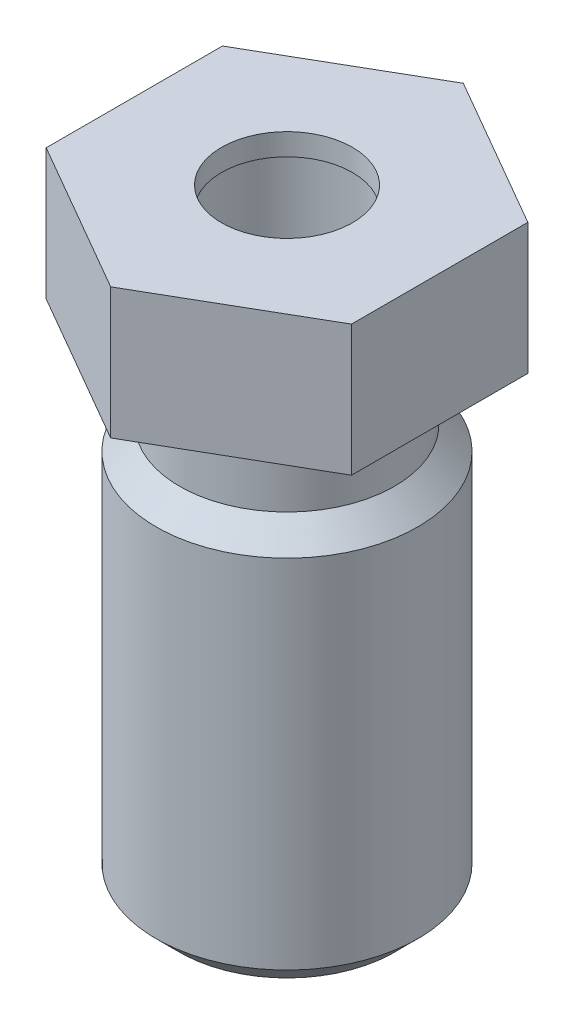
ISO-10303-21;
HEADER;
FILE_DESCRIPTION(('STEP AP214'),'2;1');
FILE_NAME('part.step','',(''),(''),'','','');
FILE_SCHEMA(('AUTOMOTIVE_DESIGN { 1 0 10303 214 1 1 1 1 }'));
ENDSEC;
DATA;
#1=APPLICATION_CONTEXT('core data for automotive mechanical design processes');
#2=APPLICATION_PROTOCOL_DEFINITION('international standard','automotive_design',2000,#1);
#3=PRODUCT_CONTEXT('',#1,'mechanical');
#4=PRODUCT('Part','Part','',(#3));
#5=PRODUCT_RELATED_PRODUCT_CATEGORY('part','',(#4));
#6=PRODUCT_DEFINITION_FORMATION('','',#4);
#7=PRODUCT_DEFINITION_CONTEXT('part definition',#1,'design');
#8=PRODUCT_DEFINITION('design','',#6,#7);
#9=PRODUCT_DEFINITION_SHAPE('','',#8);
#10=(LENGTH_UNIT() NAMED_UNIT(*) SI_UNIT(.MILLI.,.METRE.));
#11=(NAMED_UNIT(*) PLANE_ANGLE_UNIT() SI_UNIT($,.RADIAN.));
#12=(NAMED_UNIT(*) SI_UNIT($,.STERADIAN.) SOLID_ANGLE_UNIT());
#13=UNCERTAINTY_MEASURE_WITH_UNIT(LENGTH_MEASURE(1.E-05),#10,'distance_accuracy_value','');
#14=(GEOMETRIC_REPRESENTATION_CONTEXT(3) GLOBAL_UNCERTAINTY_ASSIGNED_CONTEXT((#13)) GLOBAL_UNIT_ASSIGNED_CONTEXT((#10,
#11,#12)) REPRESENTATION_CONTEXT('',''));
#15=CARTESIAN_POINT('',(0.,0.,0.));
#16=DIRECTION('',(0.,0.,1.));
#17=DIRECTION('',(1.,0.,0.));
#18=AXIS2_PLACEMENT_3D('',#15,#16,#17);
#19=CARTESIAN_POINT('',(4.9265,-6.,0.));
#20=DIRECTION('',(0.,-1.,0.));
#21=DIRECTION('',(0.,0.,-1.));
#22=AXIS2_PLACEMENT_3D('',#19,#20,#21);
#23=PLANE('',#22);
#24=CARTESIAN_POINT('',(0.,-6.,0.));
#25=DIRECTION('',(0.,-1.,0.));
#26=DIRECTION('',(0.,0.,-1.));
#27=AXIS2_PLACEMENT_3D('',#24,#25,#26);
#28=CIRCLE('',#27,4.9265);
#29=CARTESIAN_POINT('',(0.,-6.,-4.9265));
#30=VERTEX_POINT('',#29);
#31=EDGE_CURVE('E93',#30,#30,#28,.T.);
#32=ORIENTED_EDGE('',*,*,#31,.F.);
#33=EDGE_LOOP('',(#32));
#34=FACE_BOUND('',#33,.T.);
#35=DIRECTION('',(0.866025403784438,0.,0.5));
#36=VECTOR('',#35,1.);
#37=CARTESIAN_POINT('',(-7.,-6.,4.0414518843274));
#38=LINE('',#37,#36);
#39=CARTESIAN_POINT('',(-7.,-6.,4.0414518843274));
#40=VERTEX_POINT('',#39);
#41=CARTESIAN_POINT('',(0.,-6.,8.0829037686548));
#42=VERTEX_POINT('',#41);
#43=EDGE_CURVE('E80',#40,#42,#38,.T.);
#44=ORIENTED_EDGE('',*,*,#43,.F.);
#45=DIRECTION('',(0.,0.,1.));
#46=VECTOR('',#45,1.);
#47=CARTESIAN_POINT('',(-7.,-6.,-4.0414518843274));
#48=LINE('',#47,#46);
#49=CARTESIAN_POINT('',(-7.,-6.,-4.0414518843274));
#50=VERTEX_POINT('',#49);
#51=EDGE_CURVE('E69',#50,#40,#48,.T.);
#52=ORIENTED_EDGE('',*,*,#51,.F.);
#53=DIRECTION('',(-0.866025403784438,0.,0.5));
#54=VECTOR('',#53,1.);
#55=CARTESIAN_POINT('',(0.,-6.,-8.0829037686548));
#56=LINE('',#55,#54);
#57=CARTESIAN_POINT('',(0.,-6.,-8.0829037686548));
#58=VERTEX_POINT('',#57);
#59=EDGE_CURVE('E79',#58,#50,#56,.T.);
#60=ORIENTED_EDGE('',*,*,#59,.F.);
#61=DIRECTION('',(-0.866025403784438,0.,-0.5));
#62=VECTOR('',#61,1.);
#63=CARTESIAN_POINT('',(7.,-6.,-4.0414518843274));
#64=LINE('',#63,#62);
#65=CARTESIAN_POINT('',(7.,-6.,-4.0414518843274));
#66=VERTEX_POINT('',#65);
#67=EDGE_CURVE('E103',#66,#58,#64,.T.);
#68=ORIENTED_EDGE('',*,*,#67,.F.);
#69=DIRECTION('',(0.,0.,-1.));
#70=VECTOR('',#69,1.);
#71=CARTESIAN_POINT('',(7.,-6.,4.0414518843274));
#72=LINE('',#71,#70);
#73=CARTESIAN_POINT('',(7.,-6.,4.0414518843274));
#74=VERTEX_POINT('',#73);
#75=EDGE_CURVE('E107',#74,#66,#72,.T.);
#76=ORIENTED_EDGE('',*,*,#75,.F.);
#77=DIRECTION('',(0.866025403784438,0.,-0.5));
#78=VECTOR('',#77,1.);
#79=CARTESIAN_POINT('',(0.,-6.,8.0829037686548));
#80=LINE('',#79,#78);
#81=EDGE_CURVE('E92',#42,#74,#80,.T.);
#82=ORIENTED_EDGE('',*,*,#81,.F.);
#83=EDGE_LOOP('',(#44,#52,#60,#68,#76,#82));
#84=FACE_BOUND('',#83,.T.);
#85=ADVANCED_FACE('F17',(#34,#84),#23,.T.);
#86=CARTESIAN_POINT('',(0.,-6.,0.));
#87=DIRECTION('',(0.,-1.,0.));
#88=DIRECTION('',(0.,0.,-1.));
#89=AXIS2_PLACEMENT_3D('',#86,#87,#88);
#90=CYLINDRICAL_SURFACE('',#89,4.9265);
#91=ORIENTED_EDGE('',*,*,#31,.T.);
#92=EDGE_LOOP('',(#91));
#93=FACE_BOUND('',#92,.T.);
#94=CARTESIAN_POINT('',(0.,-9.5,0.));
#95=DIRECTION('',(0.,-1.,0.));
#96=DIRECTION('',(0.,0.,-1.));
#97=AXIS2_PLACEMENT_3D('',#94,#95,#96);
#98=CIRCLE('',#97,4.9265);
#99=CARTESIAN_POINT('',(0.,-9.5,-4.9265));
#100=VERTEX_POINT('',#99);
#101=EDGE_CURVE('E114',#100,#100,#98,.T.);
#102=ORIENTED_EDGE('',*,*,#101,.F.);
#103=EDGE_LOOP('',(#102));
#104=FACE_BOUND('',#103,.T.);
#105=ADVANCED_FACE('F198',(#93,#104),#90,.T.);
#106=CARTESIAN_POINT('',(-7.,-6.,4.0414518843274));
#107=DIRECTION('',(-0.5,0.,0.866025403784438));
#108=DIRECTION('',(0.866025403784438,0.,0.5));
#109=AXIS2_PLACEMENT_3D('',#106,#107,#108);
#110=PLANE('',#109);
#111=DIRECTION('',(0.866025403784438,0.,0.5));
#112=VECTOR('',#111,1.);
#113=CARTESIAN_POINT('',(-7.,0.,4.0414518843274));
#114=LINE('',#113,#112);
#115=CARTESIAN_POINT('',(-7.,0.,4.0414518843274));
#116=VERTEX_POINT('',#115);
#117=CARTESIAN_POINT('',(0.,0.,8.0829037686548));
#118=VERTEX_POINT('',#117);
#119=EDGE_CURVE('E87',#116,#118,#114,.T.);
#120=ORIENTED_EDGE('',*,*,#119,.F.);
#121=DIRECTION('',(0.,1.,0.));
#122=VECTOR('',#121,1.);
#123=CARTESIAN_POINT('',(-7.,-6.,4.0414518843274));
#124=LINE('',#123,#122);
#125=EDGE_CURVE('E73',#40,#116,#124,.T.);
#126=ORIENTED_EDGE('',*,*,#125,.F.);
#127=ORIENTED_EDGE('',*,*,#43,.T.);
#128=DIRECTION('',(0.,1.,0.));
#129=VECTOR('',#128,1.);
#130=CARTESIAN_POINT('',(0.,-6.,8.0829037686548));
#131=LINE('',#130,#129);
#132=EDGE_CURVE('E88',#42,#118,#131,.T.);
#133=ORIENTED_EDGE('',*,*,#132,.T.);
#134=EDGE_LOOP('',(#120,#126,#127,#133));
#135=FACE_BOUND('',#134,.T.);
#136=ADVANCED_FACE('F85',(#135),#110,.T.);
#137=CARTESIAN_POINT('',(-7.,-6.,-4.0414518843274));
#138=DIRECTION('',(-1.,0.,0.));
#139=DIRECTION('',(0.,0.,1.));
#140=AXIS2_PLACEMENT_3D('',#137,#138,#139);
#141=PLANE('',#140);
#142=DIRECTION('',(0.,0.,1.));
#143=VECTOR('',#142,1.);
#144=CARTESIAN_POINT('',(-7.,0.,-4.0414518843274));
#145=LINE('',#144,#143);
#146=CARTESIAN_POINT('',(-7.,0.,-4.0414518843274));
#147=VERTEX_POINT('',#146);
#148=EDGE_CURVE('E125',#147,#116,#145,.T.);
#149=ORIENTED_EDGE('',*,*,#148,.F.);
#150=DIRECTION('',(0.,1.,0.));
#151=VECTOR('',#150,1.);
#152=CARTESIAN_POINT('',(-7.,-6.,-4.0414518843274));
#153=LINE('',#152,#151);
#154=EDGE_CURVE('E75',#50,#147,#153,.T.);
#155=ORIENTED_EDGE('',*,*,#154,.F.);
#156=ORIENTED_EDGE('',*,*,#51,.T.);
#157=ORIENTED_EDGE('',*,*,#125,.T.);
#158=EDGE_LOOP('',(#149,#155,#156,#157));
#159=FACE_BOUND('',#158,.T.);
#160=ADVANCED_FACE('F72',(#159),#141,.T.);
#161=CARTESIAN_POINT('',(0.,-6.,-8.0829037686548));
#162=DIRECTION('',(-0.5,0.,-0.866025403784438));
#163=DIRECTION('',(-0.866025403784438,0.,0.5));
#164=AXIS2_PLACEMENT_3D('',#161,#162,#163);
#165=PLANE('',#164);
#166=DIRECTION('',(-0.866025403784438,0.,0.5));
#167=VECTOR('',#166,1.);
#168=CARTESIAN_POINT('',(0.,0.,-8.0829037686548));
#169=LINE('',#168,#167);
#170=CARTESIAN_POINT('',(0.,0.,-8.0829037686548));
#171=VERTEX_POINT('',#170);
#172=EDGE_CURVE('E132',#171,#147,#169,.T.);
#173=ORIENTED_EDGE('',*,*,#172,.F.);
#174=DIRECTION('',(0.,1.,0.));
#175=VECTOR('',#174,1.);
#176=CARTESIAN_POINT('',(0.,-6.,-8.0829037686548));
#177=LINE('',#176,#175);
#178=EDGE_CURVE('E136',#58,#171,#177,.T.);
#179=ORIENTED_EDGE('',*,*,#178,.F.);
#180=ORIENTED_EDGE('',*,*,#59,.T.);
#181=ORIENTED_EDGE('',*,*,#154,.T.);
#182=EDGE_LOOP('',(#173,#179,#180,#181));
#183=FACE_BOUND('',#182,.T.);
#184=ADVANCED_FACE('F212',(#183),#165,.T.);
#185=CARTESIAN_POINT('',(7.,-6.,-4.0414518843274));
#186=DIRECTION('',(0.5,0.,-0.866025403784438));
#187=DIRECTION('',(-0.866025403784438,0.,-0.5));
#188=AXIS2_PLACEMENT_3D('',#185,#186,#187);
#189=PLANE('',#188);
#190=DIRECTION('',(-0.866025403784438,0.,-0.5));
#191=VECTOR('',#190,1.);
#192=CARTESIAN_POINT('',(7.,0.,-4.0414518843274));
#193=LINE('',#192,#191);
#194=CARTESIAN_POINT('',(7.,0.,-4.0414518843274));
#195=VERTEX_POINT('',#194);
#196=EDGE_CURVE('E141',#195,#171,#193,.T.);
#197=ORIENTED_EDGE('',*,*,#196,.F.);
#198=DIRECTION('',(0.,1.,0.));
#199=VECTOR('',#198,1.);
#200=CARTESIAN_POINT('',(7.,-6.,-4.0414518843274));
#201=LINE('',#200,#199);
#202=EDGE_CURVE('E145',#66,#195,#201,.T.);
#203=ORIENTED_EDGE('',*,*,#202,.F.);
#204=ORIENTED_EDGE('',*,*,#67,.T.);
#205=ORIENTED_EDGE('',*,*,#178,.T.);
#206=EDGE_LOOP('',(#197,#203,#204,#205));
#207=FACE_BOUND('',#206,.T.);
#208=ADVANCED_FACE('F215',(#207),#189,.T.);
#209=CARTESIAN_POINT('',(7.,-6.,4.0414518843274));
#210=DIRECTION('',(1.,0.,0.));
#211=DIRECTION('',(0.,0.,-1.));
#212=AXIS2_PLACEMENT_3D('',#209,#210,#211);
#213=PLANE('',#212);
#214=DIRECTION('',(0.,0.,-1.));
#215=VECTOR('',#214,1.);
#216=CARTESIAN_POINT('',(7.,0.,4.0414518843274));
#217=LINE('',#216,#215);
#218=CARTESIAN_POINT('',(7.,0.,4.0414518843274));
#219=VERTEX_POINT('',#218);
#220=EDGE_CURVE('E36',#219,#195,#217,.T.);
#221=ORIENTED_EDGE('',*,*,#220,.F.);
#222=DIRECTION('',(0.,1.,0.));
#223=VECTOR('',#222,1.);
#224=CARTESIAN_POINT('',(7.,-6.,4.0414518843274));
#225=LINE('',#224,#223);
#226=EDGE_CURVE('E153',#74,#219,#225,.T.);
#227=ORIENTED_EDGE('',*,*,#226,.F.);
#228=ORIENTED_EDGE('',*,*,#75,.T.);
#229=ORIENTED_EDGE('',*,*,#202,.T.);
#230=EDGE_LOOP('',(#221,#227,#228,#229));
#231=FACE_BOUND('',#230,.T.);
#232=ADVANCED_FACE('F219',(#231),#213,.T.);
#233=CARTESIAN_POINT('',(0.,-6.,8.0829037686548));
#234=DIRECTION('',(0.5,0.,0.866025403784438));
#235=DIRECTION('',(0.866025403784438,0.,-0.5));
#236=AXIS2_PLACEMENT_3D('',#233,#234,#235);
#237=PLANE('',#236);
#238=DIRECTION('',(0.866025403784439,0.,-0.5));
#239=VECTOR('',#238,1.);
#240=CARTESIAN_POINT('',(0.,0.,8.0829037686548));
#241=LINE('',#240,#239);
#242=EDGE_CURVE('E32',#118,#219,#241,.T.);
#243=ORIENTED_EDGE('',*,*,#242,.F.);
#244=ORIENTED_EDGE('',*,*,#132,.F.);
#245=ORIENTED_EDGE('',*,*,#81,.T.);
#246=ORIENTED_EDGE('',*,*,#226,.T.);
#247=EDGE_LOOP('',(#243,#244,#245,#246));
#248=FACE_BOUND('',#247,.T.);
#249=ADVANCED_FACE('F223',(#248),#237,.T.);
#250=CARTESIAN_POINT('',(0.,-10.5735,0.));
#251=DIRECTION('',(0.,-1.,0.));
#252=DIRECTION('',(0.,0.,-1.));
#253=AXIS2_PLACEMENT_3D('',#250,#251,#252);
#254=CONICAL_SURFACE('',#253,6.,0.785398163397448);
#255=ORIENTED_EDGE('',*,*,#101,.T.);
#256=EDGE_LOOP('',(#255));
#257=FACE_BOUND('',#256,.T.);
#258=CARTESIAN_POINT('',(0.,-10.5735,0.));
#259=DIRECTION('',(0.,-1.,0.));
#260=DIRECTION('',(0.,0.,-1.));
#261=AXIS2_PLACEMENT_3D('',#258,#259,#260);
#262=CIRCLE('',#261,6.);
#263=CARTESIAN_POINT('',(0.,-10.5735,-6.));
#264=VERTEX_POINT('',#263);
#265=EDGE_CURVE('E161',#264,#264,#262,.T.);
#266=ORIENTED_EDGE('',*,*,#265,.F.);
#267=EDGE_LOOP('',(#266));
#268=FACE_BOUND('',#267,.T.);
#269=ADVANCED_FACE('F227',(#257,#268),#254,.T.);
#270=CARTESIAN_POINT('',(14.,0.,0.));
#271=DIRECTION('',(0.,1.,0.));
#272=DIRECTION('',(0.,0.,1.));
#273=AXIS2_PLACEMENT_3D('',#270,#271,#272);
#274=PLANE('',#273);
#275=CARTESIAN_POINT('',(0.,0.,0.));
#276=DIRECTION('',(0.,-1.,0.));
#277=DIRECTION('',(0.,0.,-1.));
#278=AXIS2_PLACEMENT_3D('',#275,#276,#277);
#279=CIRCLE('',#278,3.);
#280=CARTESIAN_POINT('',(0.,0.,-3.));
#281=VERTEX_POINT('',#280);
#282=EDGE_CURVE('E166',#281,#281,#279,.T.);
#283=ORIENTED_EDGE('',*,*,#282,.T.);
#284=EDGE_LOOP('',(#283));
#285=FACE_BOUND('',#284,.T.);
#286=ORIENTED_EDGE('',*,*,#172,.T.);
#287=ORIENTED_EDGE('',*,*,#148,.T.);
#288=ORIENTED_EDGE('',*,*,#119,.T.);
#289=ORIENTED_EDGE('',*,*,#242,.T.);
#290=ORIENTED_EDGE('',*,*,#220,.T.);
#291=ORIENTED_EDGE('',*,*,#196,.T.);
#292=EDGE_LOOP('',(#286,#287,#288,#289,#290,#291));
#293=FACE_BOUND('',#292,.T.);
#294=ADVANCED_FACE('F231',(#285,#293),#274,.T.);
#295=CARTESIAN_POINT('',(0.,-6.,0.));
#296=DIRECTION('',(0.,-1.,0.));
#297=DIRECTION('',(0.,0.,-1.));
#298=AXIS2_PLACEMENT_3D('',#295,#296,#297);
#299=CYLINDRICAL_SURFACE('',#298,6.);
#300=ORIENTED_EDGE('',*,*,#265,.T.);
#301=EDGE_LOOP('',(#300));
#302=FACE_BOUND('',#301,.T.);
#303=CARTESIAN_POINT('',(0.,-26.9265,0.));
#304=DIRECTION('',(0.,-1.,0.));
#305=DIRECTION('',(0.,0.,-1.));
#306=AXIS2_PLACEMENT_3D('',#303,#304,#305);
#307=CIRCLE('',#306,6.);
#308=CARTESIAN_POINT('',(0.,-26.9265,-6.));
#309=VERTEX_POINT('',#308);
#310=EDGE_CURVE('E169',#309,#309,#307,.T.);
#311=ORIENTED_EDGE('',*,*,#310,.F.);
#312=EDGE_LOOP('',(#311));
#313=FACE_BOUND('',#312,.T.);
#314=ADVANCED_FACE('F235',(#302,#313),#299,.T.);
#315=CARTESIAN_POINT('',(0.,-6.,0.));
#316=DIRECTION('',(0.,-1.,0.));
#317=DIRECTION('',(0.,0.,-1.));
#318=AXIS2_PLACEMENT_3D('',#315,#316,#317);
#319=CYLINDRICAL_SURFACE('',#318,3.);
#320=CARTESIAN_POINT('',(0.,-1.,0.));
#321=DIRECTION('',(0.,-1.,0.));
#322=DIRECTION('',(0.,0.,-1.));
#323=AXIS2_PLACEMENT_3D('',#320,#321,#322);
#324=CIRCLE('',#323,3.);
#325=CARTESIAN_POINT('',(0.,-1.,-3.));
#326=VERTEX_POINT('',#325);
#327=EDGE_CURVE('E172',#326,#326,#324,.T.);
#328=ORIENTED_EDGE('',*,*,#327,.T.);
#329=EDGE_LOOP('',(#328));
#330=FACE_BOUND('',#329,.T.);
#331=ORIENTED_EDGE('',*,*,#282,.F.);
#332=EDGE_LOOP('',(#331));
#333=FACE_BOUND('',#332,.T.);
#334=ADVANCED_FACE('F239',(#330,#333),#319,.F.);
#335=CARTESIAN_POINT('',(0.,-28.,0.));
#336=DIRECTION('',(0.,1.,0.));
#337=DIRECTION('',(0.,0.,1.));
#338=AXIS2_PLACEMENT_3D('',#335,#336,#337);
#339=CONICAL_SURFACE('',#338,4.9265,0.785398163397449);
#340=ORIENTED_EDGE('',*,*,#310,.T.);
#341=EDGE_LOOP('',(#340));
#342=FACE_BOUND('',#341,.T.);
#343=CARTESIAN_POINT('',(0.,-28.,0.));
#344=DIRECTION('',(0.,-1.,0.));
#345=DIRECTION('',(0.,0.,-1.));
#346=AXIS2_PLACEMENT_3D('',#343,#344,#345);
#347=CIRCLE('',#346,4.9265);
#348=CARTESIAN_POINT('',(0.,-28.,-4.9265));
#349=VERTEX_POINT('',#348);
#350=EDGE_CURVE('E175',#349,#349,#347,.T.);
#351=ORIENTED_EDGE('',*,*,#350,.F.);
#352=EDGE_LOOP('',(#351));
#353=FACE_BOUND('',#352,.T.);
#354=ADVANCED_FACE('F243',(#342,#353),#339,.T.);
#355=CARTESIAN_POINT('',(3.,-1.,0.));
#356=DIRECTION('',(0.,-1.,0.));
#357=DIRECTION('',(0.,0.,-1.));
#358=AXIS2_PLACEMENT_3D('',#355,#356,#357);
#359=PLANE('',#358);
#360=CARTESIAN_POINT('',(0.,-1.,0.));
#361=DIRECTION('',(0.,-1.,0.));
#362=DIRECTION('',(0.,0.,-1.));
#363=AXIS2_PLACEMENT_3D('',#360,#361,#362);
#364=CIRCLE('',#363,3.5);
#365=CARTESIAN_POINT('',(0.,-1.,-3.5));
#366=VERTEX_POINT('',#365);
#367=EDGE_CURVE('E178',#366,#366,#364,.T.);
#368=ORIENTED_EDGE('',*,*,#367,.T.);
#369=EDGE_LOOP('',(#368));
#370=FACE_BOUND('',#369,.T.);
#371=ORIENTED_EDGE('',*,*,#327,.F.);
#372=EDGE_LOOP('',(#371));
#373=FACE_BOUND('',#372,.T.);
#374=ADVANCED_FACE('F247',(#370,#373),#359,.T.);
#375=CARTESIAN_POINT('',(3.,-28.,0.));
#376=DIRECTION('',(0.,-1.,0.));
#377=DIRECTION('',(0.,0.,-1.));
#378=AXIS2_PLACEMENT_3D('',#375,#376,#377);
#379=PLANE('',#378);
#380=ORIENTED_EDGE('',*,*,#350,.T.);
#381=EDGE_LOOP('',(#380));
#382=FACE_BOUND('',#381,.T.);
#383=CARTESIAN_POINT('',(0.,-28.,0.));
#384=DIRECTION('',(0.,-1.,0.));
#385=DIRECTION('',(0.,0.,-1.));
#386=AXIS2_PLACEMENT_3D('',#383,#384,#385);
#387=CIRCLE('',#386,3.);
#388=CARTESIAN_POINT('',(0.,-28.,-3.));
#389=VERTEX_POINT('',#388);
#390=EDGE_CURVE('E181',#389,#389,#387,.T.);
#391=ORIENTED_EDGE('',*,*,#390,.F.);
#392=EDGE_LOOP('',(#391));
#393=FACE_BOUND('',#392,.T.);
#394=ADVANCED_FACE('F251',(#382,#393),#379,.T.);
#395=CARTESIAN_POINT('',(0.,-6.,0.));
#396=DIRECTION('',(0.,-1.,0.));
#397=DIRECTION('',(0.,0.,-1.));
#398=AXIS2_PLACEMENT_3D('',#395,#396,#397);
#399=CYLINDRICAL_SURFACE('',#398,3.5);
#400=CARTESIAN_POINT('',(0.,-11.,0.));
#401=DIRECTION('',(0.,-1.,0.));
#402=DIRECTION('',(0.,0.,-1.));
#403=AXIS2_PLACEMENT_3D('',#400,#401,#402);
#404=CIRCLE('',#403,3.5);
#405=CARTESIAN_POINT('',(0.,-11.,-3.5));
#406=VERTEX_POINT('',#405);
#407=EDGE_CURVE('E25',#406,#406,#404,.T.);
#408=ORIENTED_EDGE('',*,*,#407,.T.);
#409=EDGE_LOOP('',(#408));
#410=FACE_BOUND('',#409,.T.);
#411=ORIENTED_EDGE('',*,*,#367,.F.);
#412=EDGE_LOOP('',(#411));
#413=FACE_BOUND('',#412,.T.);
#414=ADVANCED_FACE('F186',(#410,#413),#399,.F.);
#415=CARTESIAN_POINT('',(0.,-6.,0.));
#416=DIRECTION('',(0.,-1.,0.));
#417=DIRECTION('',(0.,0.,-1.));
#418=AXIS2_PLACEMENT_3D('',#415,#416,#417);
#419=CYLINDRICAL_SURFACE('',#418,3.);
#420=ORIENTED_EDGE('',*,*,#390,.T.);
#421=EDGE_LOOP('',(#420));
#422=FACE_BOUND('',#421,.T.);
#423=CARTESIAN_POINT('',(0.,-11.,0.));
#424=DIRECTION('',(0.,-1.,0.));
#425=DIRECTION('',(0.,0.,-1.));
#426=AXIS2_PLACEMENT_3D('',#423,#424,#425);
#427=CIRCLE('',#426,3.);
#428=CARTESIAN_POINT('',(0.,-11.,-3.));
#429=VERTEX_POINT('',#428);
#430=EDGE_CURVE('E11',#429,#429,#427,.T.);
#431=ORIENTED_EDGE('',*,*,#430,.F.);
#432=EDGE_LOOP('',(#431));
#433=FACE_BOUND('',#432,.T.);
#434=ADVANCED_FACE('F190',(#422,#433),#419,.F.);
#435=CARTESIAN_POINT('',(3.5,-11.,0.));
#436=DIRECTION('',(0.,1.,0.));
#437=DIRECTION('',(0.,0.,1.));
#438=AXIS2_PLACEMENT_3D('',#435,#436,#437);
#439=PLANE('',#438);
#440=ORIENTED_EDGE('',*,*,#430,.T.);
#441=EDGE_LOOP('',(#440));
#442=FACE_BOUND('',#441,.T.);
#443=ORIENTED_EDGE('',*,*,#407,.F.);
#444=EDGE_LOOP('',(#443));
#445=FACE_BOUND('',#444,.T.);
#446=ADVANCED_FACE('F19',(#442,#445),#439,.T.);
#447=CLOSED_SHELL('',(#85,#105,#136,#160,#184,#208,#232,#249,#269,#294,#314,#334,#354,#374,#394,
#414,#434,#446));
#448=MANIFOLD_SOLID_BREP('B1',#447);
#449=ADVANCED_BREP_SHAPE_REPRESENTATION('',(#18,#448),#14);
#450=SHAPE_DEFINITION_REPRESENTATION(#9,#449);
ENDSEC;
END-ISO-10303-21;
